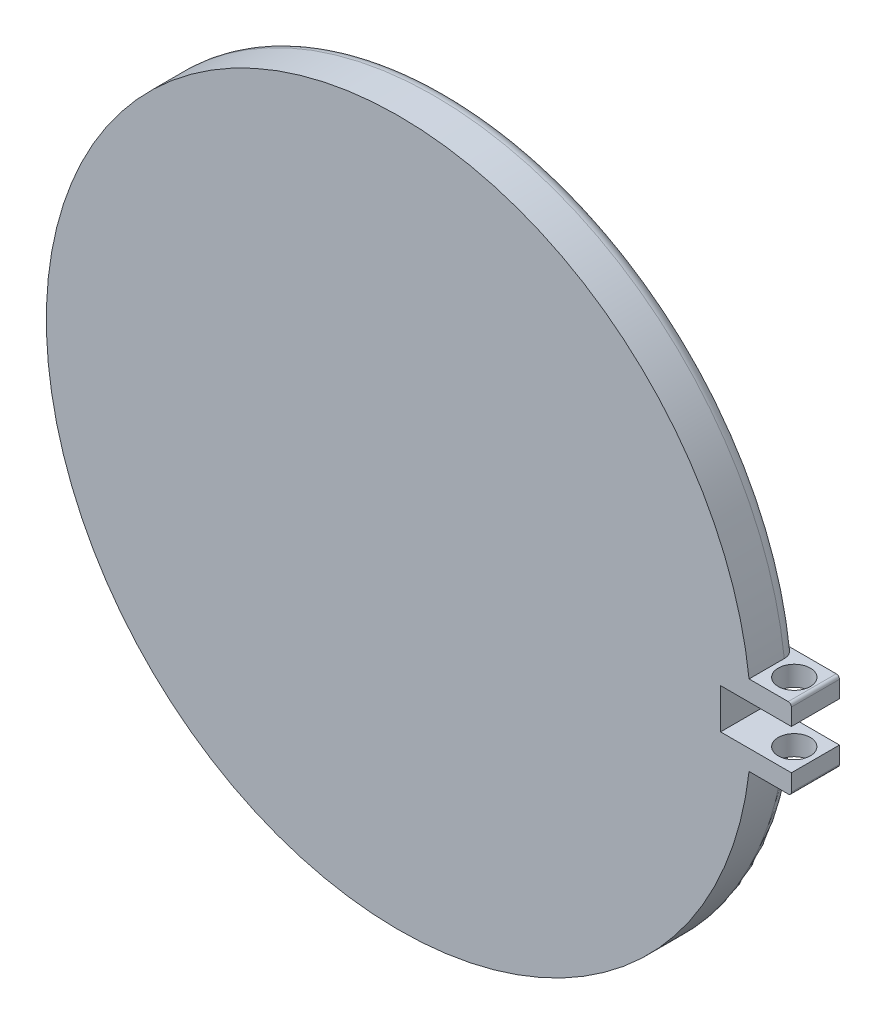
ISO-10303-21;
HEADER;
FILE_DESCRIPTION(('STEP AP214'),'2;1');
FILE_NAME('part.step','',(''),(''),'','','');
FILE_SCHEMA(('AUTOMOTIVE_DESIGN { 1 0 10303 214 1 1 1 1 }'));
ENDSEC;
DATA;
#1=APPLICATION_CONTEXT('core data for automotive mechanical design processes');
#2=APPLICATION_PROTOCOL_DEFINITION('international standard','automotive_design',2000,#1);
#3=PRODUCT_CONTEXT('',#1,'mechanical');
#4=PRODUCT('Part','Part','',(#3));
#5=PRODUCT_RELATED_PRODUCT_CATEGORY('part','',(#4));
#6=PRODUCT_DEFINITION_FORMATION('','',#4);
#7=PRODUCT_DEFINITION_CONTEXT('part definition',#1,'design');
#8=PRODUCT_DEFINITION('design','',#6,#7);
#9=PRODUCT_DEFINITION_SHAPE('','',#8);
#10=(LENGTH_UNIT() NAMED_UNIT(*) SI_UNIT(.MILLI.,.METRE.));
#11=(NAMED_UNIT(*) PLANE_ANGLE_UNIT() SI_UNIT($,.RADIAN.));
#12=(NAMED_UNIT(*) SI_UNIT($,.STERADIAN.) SOLID_ANGLE_UNIT());
#13=UNCERTAINTY_MEASURE_WITH_UNIT(LENGTH_MEASURE(1.E-05),#10,'distance_accuracy_value','');
#14=(GEOMETRIC_REPRESENTATION_CONTEXT(3) GLOBAL_UNCERTAINTY_ASSIGNED_CONTEXT((#13)) GLOBAL_UNIT_ASSIGNED_CONTEXT((#10,
#11,#12)) REPRESENTATION_CONTEXT('',''));
#15=CARTESIAN_POINT('',(0.,0.,0.));
#16=DIRECTION('',(0.,0.,1.));
#17=DIRECTION('',(1.,0.,0.));
#18=AXIS2_PLACEMENT_3D('',#15,#16,#17);
#19=CARTESIAN_POINT('',(24.5,2.5,0.));
#20=DIRECTION('',(1.,0.,0.));
#21=DIRECTION('',(0.,0.,-1.));
#22=AXIS2_PLACEMENT_3D('',#19,#20,#21);
#23=PLANE('',#22);
#24=DIRECTION('',(0.,1.,0.));
#25=VECTOR('',#24,1.);
#26=CARTESIAN_POINT('',(24.5,2.5,0.));
#27=LINE('',#26,#25);
#28=CARTESIAN_POINT('',(24.5,1.25,0.));
#29=VERTEX_POINT('',#28);
#30=CARTESIAN_POINT('',(24.5,2.3,0.));
#31=VERTEX_POINT('',#30);
#32=EDGE_CURVE('E168',#29,#31,#27,.T.);
#33=ORIENTED_EDGE('',*,*,#32,.T.);
#34=DIRECTION('',(0.,0.,1.));
#35=VECTOR('',#34,1.);
#36=CARTESIAN_POINT('',(24.5,2.3,0.));
#37=LINE('',#36,#35);
#38=CARTESIAN_POINT('',(24.5,2.3,3.));
#39=VERTEX_POINT('',#38);
#40=EDGE_CURVE('E205',#31,#39,#37,.T.);
#41=ORIENTED_EDGE('',*,*,#40,.T.);
#42=DIRECTION('',(0.,1.,0.));
#43=VECTOR('',#42,1.);
#44=CARTESIAN_POINT('',(24.5,2.5,3.));
#45=LINE('',#44,#43);
#46=CARTESIAN_POINT('',(24.5,1.25,3.));
#47=VERTEX_POINT('',#46);
#48=EDGE_CURVE('E164',#47,#39,#45,.T.);
#49=ORIENTED_EDGE('',*,*,#48,.F.);
#50=DIRECTION('',(0.,0.,1.));
#51=VECTOR('',#50,1.);
#52=CARTESIAN_POINT('',(24.5,1.25,0.));
#53=LINE('',#52,#51);
#54=EDGE_CURVE('E132',#29,#47,#53,.T.);
#55=ORIENTED_EDGE('',*,*,#54,.F.);
#56=EDGE_LOOP('',(#33,#41,#49,#55));
#57=FACE_BOUND('',#56,.T.);
#58=ADVANCED_FACE('F33',(#57),#23,.T.);
#59=CARTESIAN_POINT('',(23.1787464971972,-22.,1.5));
#60=DIRECTION('',(0.,1.,0.));
#61=DIRECTION('',(0.,0.,1.));
#62=AXIS2_PLACEMENT_3D('',#59,#60,#61);
#63=CYLINDRICAL_SURFACE('',#62,1.);
#64=CARTESIAN_POINT('',(23.1787464971972,1.25,1.5));
#65=DIRECTION('',(0.,1.,0.));
#66=DIRECTION('',(0.,0.,1.));
#67=AXIS2_PLACEMENT_3D('',#64,#65,#66);
#68=CIRCLE('',#67,1.);
#69=CARTESIAN_POINT('',(23.1787464971972,1.25,2.5));
#70=VERTEX_POINT('',#69);
#71=EDGE_CURVE('E188',#70,#70,#68,.F.);
#72=ORIENTED_EDGE('',*,*,#71,.T.);
#73=EDGE_LOOP('',(#72));
#74=FACE_BOUND('',#73,.T.);
#75=CARTESIAN_POINT('',(23.1787464971972,2.5,1.5));
#76=DIRECTION('',(0.,1.,0.));
#77=DIRECTION('',(0.,0.,1.));
#78=AXIS2_PLACEMENT_3D('',#75,#76,#77);
#79=CIRCLE('',#78,1.);
#80=CARTESIAN_POINT('',(23.1787464971972,2.5,2.5));
#81=VERTEX_POINT('',#80);
#82=EDGE_CURVE('E165',#81,#81,#79,.T.);
#83=ORIENTED_EDGE('',*,*,#82,.T.);
#84=EDGE_LOOP('',(#83));
#85=FACE_BOUND('',#84,.T.);
#86=ADVANCED_FACE('F242',(#74,#85),#63,.F.);
#87=CARTESIAN_POINT('',(0.,0.,3.));
#88=DIRECTION('',(0.,0.,-1.));
#89=DIRECTION('',(-1.,0.,0.));
#90=AXIS2_PLACEMENT_3D('',#87,#88,#89);
#91=CYLINDRICAL_SURFACE('',#90,22.);
#92=DIRECTION('',(0.,0.,-1.));
#93=VECTOR('',#92,1.);
#94=CARTESIAN_POINT('',(21.8574929943944,2.5,3.));
#95=LINE('',#94,#93);
#96=CARTESIAN_POINT('',(21.8574929943944,2.5,3.));
#97=VERTEX_POINT('',#96);
#98=CARTESIAN_POINT('',(21.8574929943944,2.5,0.8));
#99=VERTEX_POINT('',#98);
#100=EDGE_CURVE('E171',#97,#99,#95,.T.);
#101=ORIENTED_EDGE('',*,*,#100,.T.);
#102=CARTESIAN_POINT('',(0.,0.,0.8));
#103=DIRECTION('',(0.,0.,1.));
#104=DIRECTION('',(1.,0.,0.));
#105=AXIS2_PLACEMENT_3D('',#102,#103,#104);
#106=CIRCLE('',#105,22.);
#107=CARTESIAN_POINT('',(21.8574929943944,-2.5,0.8));
#108=VERTEX_POINT('',#107);
#109=EDGE_CURVE('E210',#99,#108,#106,.T.);
#110=ORIENTED_EDGE('',*,*,#109,.T.);
#111=DIRECTION('',(0.,0.,-1.));
#112=VECTOR('',#111,1.);
#113=CARTESIAN_POINT('',(21.8574929943944,-2.5,3.));
#114=LINE('',#113,#112);
#115=CARTESIAN_POINT('',(21.8574929943944,-2.5,3.));
#116=VERTEX_POINT('',#115);
#117=EDGE_CURVE('E180',#108,#116,#114,.F.);
#118=ORIENTED_EDGE('',*,*,#117,.T.);
#119=CARTESIAN_POINT('',(0.,0.,3.));
#120=DIRECTION('',(0.,0.,1.));
#121=DIRECTION('',(1.,0.,0.));
#122=AXIS2_PLACEMENT_3D('',#119,#120,#121);
#123=CIRCLE('',#122,22.);
#124=EDGE_CURVE('E182',#97,#116,#123,.T.);
#125=ORIENTED_EDGE('',*,*,#124,.F.);
#126=EDGE_LOOP('',(#101,#110,#118,#125));
#127=FACE_BOUND('',#126,.T.);
#128=ADVANCED_FACE('F237',(#127),#91,.T.);
#129=CARTESIAN_POINT('',(0.,0.,3.));
#130=DIRECTION('',(0.,0.,1.));
#131=DIRECTION('',(1.,0.,0.));
#132=AXIS2_PLACEMENT_3D('',#129,#130,#131);
#133=PLANE('',#132);
#134=DIRECTION('',(0.,-1.,0.));
#135=VECTOR('',#134,1.);
#136=CARTESIAN_POINT('',(20.08,1.25,3.));
#137=LINE('',#136,#135);
#138=CARTESIAN_POINT('',(20.08,1.25,3.));
#139=VERTEX_POINT('',#138);
#140=CARTESIAN_POINT('',(20.08,-1.25,3.));
#141=VERTEX_POINT('',#140);
#142=EDGE_CURVE('E125',#139,#141,#137,.T.);
#143=ORIENTED_EDGE('',*,*,#142,.F.);
#144=DIRECTION('',(1.,0.,0.));
#145=VECTOR('',#144,1.);
#146=CARTESIAN_POINT('',(21.9,1.25,3.));
#147=LINE('',#146,#145);
#148=EDGE_CURVE('E155',#139,#47,#147,.T.);
#149=ORIENTED_EDGE('',*,*,#148,.T.);
#150=ORIENTED_EDGE('',*,*,#48,.T.);
#151=CARTESIAN_POINT('',(24.3,2.3,3.));
#152=DIRECTION('',(0.,0.,1.));
#153=DIRECTION('',(1.,0.,0.));
#154=AXIS2_PLACEMENT_3D('',#151,#152,#153);
#155=CIRCLE('',#154,0.2);
#156=CARTESIAN_POINT('',(24.3,2.5,3.));
#157=VERTEX_POINT('',#156);
#158=EDGE_CURVE('E195',#39,#157,#155,.T.);
#159=ORIENTED_EDGE('',*,*,#158,.T.);
#160=DIRECTION('',(-1.,0.,0.));
#161=VECTOR('',#160,1.);
#162=CARTESIAN_POINT('',(19.5,2.5,3.));
#163=LINE('',#162,#161);
#164=EDGE_CURVE('E173',#157,#97,#163,.T.);
#165=ORIENTED_EDGE('',*,*,#164,.T.);
#166=ORIENTED_EDGE('',*,*,#124,.T.);
#167=DIRECTION('',(1.,0.,0.));
#168=VECTOR('',#167,1.);
#169=CARTESIAN_POINT('',(19.5,-2.5,3.));
#170=LINE('',#169,#168);
#171=CARTESIAN_POINT('',(24.3,-2.5,3.));
#172=VERTEX_POINT('',#171);
#173=EDGE_CURVE('E175',#116,#172,#170,.T.);
#174=ORIENTED_EDGE('',*,*,#173,.T.);
#175=CARTESIAN_POINT('',(24.3,-2.3,3.));
#176=DIRECTION('',(0.,0.,1.));
#177=DIRECTION('',(1.,0.,0.));
#178=AXIS2_PLACEMENT_3D('',#175,#176,#177);
#179=CIRCLE('',#178,0.2);
#180=CARTESIAN_POINT('',(24.5,-2.3,3.));
#181=VERTEX_POINT('',#180);
#182=EDGE_CURVE('E197',#172,#181,#179,.T.);
#183=ORIENTED_EDGE('',*,*,#182,.T.);
#184=CARTESIAN_POINT('',(24.5,-1.25,3.));
#185=VERTEX_POINT('',#184);
#186=EDGE_CURVE('E127',#181,#185,#45,.T.);
#187=ORIENTED_EDGE('',*,*,#186,.T.);
#188=DIRECTION('',(1.,0.,0.));
#189=VECTOR('',#188,1.);
#190=CARTESIAN_POINT('',(21.9,-1.25,3.));
#191=LINE('',#190,#189);
#192=EDGE_CURVE('E120',#141,#185,#191,.T.);
#193=ORIENTED_EDGE('',*,*,#192,.F.);
#194=EDGE_LOOP('',(#143,#149,#150,#159,#165,#166,#174,#183,#187,#193));
#195=FACE_BOUND('',#194,.T.);
#196=ADVANCED_FACE('F122',(#195),#133,.T.);
#197=CARTESIAN_POINT('',(0.,0.,0.));
#198=DIRECTION('',(0.,0.,1.));
#199=DIRECTION('',(1.,0.,0.));
#200=AXIS2_PLACEMENT_3D('',#197,#198,#199);
#201=PLANE('',#200);
#202=DIRECTION('',(1.,0.,0.));
#203=VECTOR('',#202,1.);
#204=CARTESIAN_POINT('',(21.9,1.25,0.));
#205=LINE('',#204,#203);
#206=CARTESIAN_POINT('',(20.08,1.25,0.));
#207=VERTEX_POINT('',#206);
#208=EDGE_CURVE('E158',#207,#29,#205,.T.);
#209=ORIENTED_EDGE('',*,*,#208,.F.);
#210=DIRECTION('',(0.,1.,0.));
#211=VECTOR('',#210,1.);
#212=CARTESIAN_POINT('',(20.08,1.25,0.));
#213=LINE('',#212,#211);
#214=CARTESIAN_POINT('',(20.08,-1.25,0.));
#215=VERTEX_POINT('',#214);
#216=EDGE_CURVE('E142',#215,#207,#213,.T.);
#217=ORIENTED_EDGE('',*,*,#216,.F.);
#218=DIRECTION('',(1.,0.,0.));
#219=VECTOR('',#218,1.);
#220=CARTESIAN_POINT('',(21.9,-1.25,0.));
#221=LINE('',#220,#219);
#222=CARTESIAN_POINT('',(24.5,-1.25,0.));
#223=VERTEX_POINT('',#222);
#224=EDGE_CURVE('E131',#215,#223,#221,.T.);
#225=ORIENTED_EDGE('',*,*,#224,.T.);
#226=CARTESIAN_POINT('',(24.5,-2.3,0.));
#227=VERTEX_POINT('',#226);
#228=EDGE_CURVE('E166',#227,#223,#27,.T.);
#229=ORIENTED_EDGE('',*,*,#228,.F.);
#230=CARTESIAN_POINT('',(24.3,-2.3,0.));
#231=DIRECTION('',(0.,0.,1.));
#232=DIRECTION('',(1.,0.,0.));
#233=AXIS2_PLACEMENT_3D('',#230,#231,#232);
#234=CIRCLE('',#233,0.2);
#235=CARTESIAN_POINT('',(24.3,-2.5,0.));
#236=VERTEX_POINT('',#235);
#237=EDGE_CURVE('E203',#227,#236,#234,.F.);
#238=ORIENTED_EDGE('',*,*,#237,.T.);
#239=DIRECTION('',(1.,0.,0.));
#240=VECTOR('',#239,1.);
#241=CARTESIAN_POINT('',(19.5,-2.5,0.));
#242=LINE('',#241,#240);
#243=CARTESIAN_POINT('',(21.0520782822029,-2.5,0.));
#244=VERTEX_POINT('',#243);
#245=EDGE_CURVE('E53',#244,#236,#242,.T.);
#246=ORIENTED_EDGE('',*,*,#245,.F.);
#247=CARTESIAN_POINT('',(0.,0.,0.));
#248=DIRECTION('',(0.,0.,1.));
#249=DIRECTION('',(1.,0.,0.));
#250=AXIS2_PLACEMENT_3D('',#247,#248,#249);
#251=CIRCLE('',#250,21.2);
#252=CARTESIAN_POINT('',(21.0520782822029,2.5,0.));
#253=VERTEX_POINT('',#252);
#254=EDGE_CURVE('E213',#244,#253,#251,.F.);
#255=ORIENTED_EDGE('',*,*,#254,.T.);
#256=DIRECTION('',(-1.,0.,0.));
#257=VECTOR('',#256,1.);
#258=CARTESIAN_POINT('',(19.5,2.5,0.));
#259=LINE('',#258,#257);
#260=CARTESIAN_POINT('',(24.3,2.5,0.));
#261=VERTEX_POINT('',#260);
#262=EDGE_CURVE('E60',#261,#253,#259,.T.);
#263=ORIENTED_EDGE('',*,*,#262,.F.);
#264=CARTESIAN_POINT('',(24.3,2.3,0.));
#265=DIRECTION('',(0.,0.,1.));
#266=DIRECTION('',(1.,0.,0.));
#267=AXIS2_PLACEMENT_3D('',#264,#265,#266);
#268=CIRCLE('',#267,0.2);
#269=EDGE_CURVE('E201',#261,#31,#268,.F.);
#270=ORIENTED_EDGE('',*,*,#269,.T.);
#271=ORIENTED_EDGE('',*,*,#32,.F.);
#272=EDGE_LOOP('',(#209,#217,#225,#229,#238,#246,#255,#263,#270,#271));
#273=FACE_BOUND('',#272,.T.);
#274=ADVANCED_FACE('F223',(#273),#201,.F.);
#275=CARTESIAN_POINT('',(19.5,-2.5,0.));
#276=DIRECTION('',(0.,-1.,0.));
#277=DIRECTION('',(0.,0.,-1.));
#278=AXIS2_PLACEMENT_3D('',#275,#276,#277);
#279=PLANE('',#278);
#280=CARTESIAN_POINT('',(23.1787464971972,-2.5,1.5));
#281=DIRECTION('',(0.,-1.,0.));
#282=DIRECTION('',(0.,0.,-1.));
#283=AXIS2_PLACEMENT_3D('',#280,#281,#282);
#284=CIRCLE('',#283,1.);
#285=CARTESIAN_POINT('',(23.1787464971972,-2.5,0.499999999999999));
#286=VERTEX_POINT('',#285);
#287=EDGE_CURVE('E161',#286,#286,#284,.T.);
#288=ORIENTED_EDGE('',*,*,#287,.F.);
#289=EDGE_LOOP('',(#288));
#290=FACE_BOUND('',#289,.T.);
#291=ORIENTED_EDGE('',*,*,#245,.T.);
#292=DIRECTION('',(0.,0.,1.));
#293=VECTOR('',#292,1.);
#294=CARTESIAN_POINT('',(24.3,-2.5,0.));
#295=LINE('',#294,#293);
#296=EDGE_CURVE('E185',#236,#172,#295,.T.);
#297=ORIENTED_EDGE('',*,*,#296,.T.);
#298=ORIENTED_EDGE('',*,*,#173,.F.);
#299=ORIENTED_EDGE('',*,*,#117,.F.);
#300=CARTESIAN_POINT('',(21.8574929943944,-2.5,0.8));
#301=CARTESIAN_POINT('',(21.8575323983029,-2.5,0.755206794752053));
#302=CARTESIAN_POINT('',(21.8537088169753,-2.5,0.710426684375354));
#303=CARTESIAN_POINT('',(21.838628437868,-2.5,0.622178597568789));
#304=CARTESIAN_POINT('',(21.827378818546,-2.5,0.578709396326376));
#305=CARTESIAN_POINT('',(21.7977318750486,-2.5,0.494260113469563));
#306=CARTESIAN_POINT('',(21.7793315577597,-2.5,0.453281082498632));
#307=CARTESIAN_POINT('',(21.7359360852393,-2.5,0.374987058209343));
#308=CARTESIAN_POINT('',(21.7109417600343,-2.5,0.337671604545614));
#309=CARTESIAN_POINT('',(21.6549983169677,-2.5,0.267639070847792));
#310=CARTESIAN_POINT('',(21.6240328290373,-2.5,0.234935070045012));
#311=CARTESIAN_POINT('',(21.5570743364598,-2.5,0.175145063514615));
#312=CARTESIAN_POINT('',(21.5210803001772,-2.5,0.148060213428612));
#313=CARTESIAN_POINT('',(21.4448524496375,-2.5,0.100102106746732));
#314=CARTESIAN_POINT('',(21.4045931982682,-2.5,0.0792693267939344));
#315=CARTESIAN_POINT('',(21.3211700769108,-2.5,0.0446204893486213));
#316=CARTESIAN_POINT('',(21.2780076302695,-2.5,0.0308010214374727));
#317=CARTESIAN_POINT('',(21.2041901894434,-2.5,0.0138014558993165));
#318=CARTESIAN_POINT('',(21.1739785174373,-2.5,0.00862885620354199));
#319=CARTESIAN_POINT('',(21.1132079390581,-2.5,0.00172844026307003));
#320=CARTESIAN_POINT('',(21.082649588046,-2.5,-4.2679891576566E-06));
#321=CARTESIAN_POINT('',(21.0520782822029,-2.5,0.));
#322=B_SPLINE_CURVE_WITH_KNOTS('',3,(#300,#301,#302,#303,#304,#305,#306,#307,#308,#309,#310,
#311,#312,#313,#314,#315,#316,#317,#318,#319,#320,#321),.UNSPECIFIED.,.F.,.F.,(4,2,2,2,2,2,2,2,
2,2,4),(0.,0.134197634220758,0.268265734479397,0.40239001303304,0.536497416625006,
0.67097784428565,0.805485902003287,0.940846873129491,1.07614195798415,1.16791217423907,
1.25955178663206),.UNSPECIFIED.);
#323=EDGE_CURVE('E46',#108,#244,#322,.T.);
#324=ORIENTED_EDGE('',*,*,#323,.T.);
#325=EDGE_LOOP('',(#291,#297,#298,#299,#324));
#326=FACE_BOUND('',#325,.T.);
#327=ADVANCED_FACE('F218',(#290,#326),#279,.T.);
#328=CARTESIAN_POINT('',(19.5,2.5,0.));
#329=DIRECTION('',(0.,1.,0.));
#330=DIRECTION('',(0.,0.,1.));
#331=AXIS2_PLACEMENT_3D('',#328,#329,#330);
#332=PLANE('',#331);
#333=ORIENTED_EDGE('',*,*,#82,.F.);
#334=EDGE_LOOP('',(#333));
#335=FACE_BOUND('',#334,.T.);
#336=ORIENTED_EDGE('',*,*,#164,.F.);
#337=DIRECTION('',(0.,0.,1.));
#338=VECTOR('',#337,1.);
#339=CARTESIAN_POINT('',(24.3,2.5,0.));
#340=LINE('',#339,#338);
#341=EDGE_CURVE('E208',#157,#261,#340,.F.);
#342=ORIENTED_EDGE('',*,*,#341,.T.);
#343=ORIENTED_EDGE('',*,*,#262,.T.);
#344=CARTESIAN_POINT('',(21.0520782822029,2.5,0.));
#345=CARTESIAN_POINT('',(21.0976178807076,2.5,-3.72489311876958E-05));
#346=CARTESIAN_POINT('',(21.1431481988742,2.5,0.00383223828765159));
#347=CARTESIAN_POINT('',(21.2328992513541,2.5,0.0191145377678495));
#348=CARTESIAN_POINT('',(21.2771207220915,2.5,0.0305230205424953));
#349=CARTESIAN_POINT('',(21.3630422465806,2.5,0.0606221506546867));
#350=CARTESIAN_POINT('',(21.4047408758473,2.5,0.07931686853522));
#351=CARTESIAN_POINT('',(21.4843845526506,2.5,0.123458076702455));
#352=CARTESIAN_POINT('',(21.5223304890414,2.5,0.148902962876772));
#353=CARTESIAN_POINT('',(21.5932581160992,2.5,0.205744879161273));
#354=CARTESIAN_POINT('',(21.6262559960535,2.5,0.237121703645859));
#355=CARTESIAN_POINT('',(21.6864811583727,2.5,0.305009635928708));
#356=CARTESIAN_POINT('',(21.7137073817718,2.5,0.341521683881209));
#357=CARTESIAN_POINT('',(21.7614250015,2.5,0.418389109107933));
#358=CARTESIAN_POINT('',(21.7819572731295,2.5,0.458719142736872));
#359=CARTESIAN_POINT('',(21.8159027752129,2.5,0.542258430715124));
#360=CARTESIAN_POINT('',(21.8293208433886,2.5,0.585465705952222));
#361=CARTESIAN_POINT('',(21.8451369064943,2.5,0.657471179605751));
#362=CARTESIAN_POINT('',(21.8497677000959,2.5,0.685798519011981));
#363=CARTESIAN_POINT('',(21.855945171347,2.5,0.742746418508006));
#364=CARTESIAN_POINT('',(21.8574962492435,2.5,0.771366501435026));
#365=CARTESIAN_POINT('',(21.8574929943944,2.5,0.8));
#366=B_SPLINE_CURVE_WITH_KNOTS('',3,(#344,#345,#346,#347,#348,#349,#350,#351,#352,#353,#354,
#355,#356,#357,#358,#359,#360,#361,#362,#363,#364,#365),.UNSPECIFIED.,.F.,.F.,(4,2,2,2,2,2,2,2,
2,2,4),(0.,0.136441760442699,0.272805233264416,0.409244996632523,0.545652365406625,
0.681603206437472,0.817578969760933,0.952708155649584,1.08774533424824,1.17370059735632,
1.25953296037332),.UNSPECIFIED.);
#367=EDGE_CURVE('E11',#253,#99,#366,.T.);
#368=ORIENTED_EDGE('',*,*,#367,.T.);
#369=ORIENTED_EDGE('',*,*,#100,.F.);
#370=EDGE_LOOP('',(#336,#342,#343,#368,#369));
#371=FACE_BOUND('',#370,.T.);
#372=ADVANCED_FACE('F222',(#335,#371),#332,.T.);
#373=ORIENTED_EDGE('',*,*,#186,.F.);
#374=DIRECTION('',(0.,0.,1.));
#375=VECTOR('',#374,1.);
#376=CARTESIAN_POINT('',(24.5,-2.3,0.));
#377=LINE('',#376,#375);
#378=EDGE_CURVE('E199',#181,#227,#377,.F.);
#379=ORIENTED_EDGE('',*,*,#378,.T.);
#380=ORIENTED_EDGE('',*,*,#228,.T.);
#381=DIRECTION('',(0.,0.,-1.));
#382=VECTOR('',#381,1.);
#383=CARTESIAN_POINT('',(24.5,-1.25,0.));
#384=LINE('',#383,#382);
#385=EDGE_CURVE('E152',#185,#223,#384,.T.);
#386=ORIENTED_EDGE('',*,*,#385,.F.);
#387=EDGE_LOOP('',(#373,#379,#380,#386));
#388=FACE_BOUND('',#387,.T.);
#389=ADVANCED_FACE('F230',(#388),#23,.T.);
#390=CARTESIAN_POINT('',(23.1787464971972,-1.25,1.5));
#391=DIRECTION('',(0.,-1.,0.));
#392=DIRECTION('',(0.,0.,-1.));
#393=AXIS2_PLACEMENT_3D('',#390,#391,#392);
#394=CIRCLE('',#393,1.);
#395=CARTESIAN_POINT('',(23.1787464971972,-1.25,0.499999999999999));
#396=VERTEX_POINT('',#395);
#397=EDGE_CURVE('E157',#396,#396,#394,.F.);
#398=ORIENTED_EDGE('',*,*,#397,.T.);
#399=EDGE_LOOP('',(#398));
#400=FACE_BOUND('',#399,.T.);
#401=ORIENTED_EDGE('',*,*,#287,.T.);
#402=EDGE_LOOP('',(#401));
#403=FACE_BOUND('',#402,.T.);
#404=ADVANCED_FACE('F225',(#400,#403),#63,.F.);
#405=CARTESIAN_POINT('',(21.9,1.25,0.));
#406=DIRECTION('',(0.,1.,0.));
#407=DIRECTION('',(0.,0.,1.));
#408=AXIS2_PLACEMENT_3D('',#405,#406,#407);
#409=PLANE('',#408);
#410=ORIENTED_EDGE('',*,*,#54,.T.);
#411=ORIENTED_EDGE('',*,*,#148,.F.);
#412=DIRECTION('',(0.,0.,1.));
#413=VECTOR('',#412,1.);
#414=CARTESIAN_POINT('',(20.08,1.25,3.));
#415=LINE('',#414,#413);
#416=EDGE_CURVE('E147',#207,#139,#415,.T.);
#417=ORIENTED_EDGE('',*,*,#416,.F.);
#418=ORIENTED_EDGE('',*,*,#208,.T.);
#419=EDGE_LOOP('',(#410,#411,#417,#418));
#420=FACE_BOUND('',#419,.T.);
#421=ORIENTED_EDGE('',*,*,#71,.F.);
#422=EDGE_LOOP('',(#421));
#423=FACE_BOUND('',#422,.T.);
#424=ADVANCED_FACE('F281',(#420,#423),#409,.F.);
#425=CARTESIAN_POINT('',(21.9,-1.25,0.));
#426=DIRECTION('',(0.,-1.,0.));
#427=DIRECTION('',(0.,0.,-1.));
#428=AXIS2_PLACEMENT_3D('',#425,#426,#427);
#429=PLANE('',#428);
#430=ORIENTED_EDGE('',*,*,#385,.T.);
#431=ORIENTED_EDGE('',*,*,#224,.F.);
#432=DIRECTION('',(0.,0.,-1.));
#433=VECTOR('',#432,1.);
#434=CARTESIAN_POINT('',(20.08,-1.25,3.));
#435=LINE('',#434,#433);
#436=EDGE_CURVE('E135',#141,#215,#435,.T.);
#437=ORIENTED_EDGE('',*,*,#436,.F.);
#438=ORIENTED_EDGE('',*,*,#192,.T.);
#439=EDGE_LOOP('',(#430,#431,#437,#438));
#440=FACE_BOUND('',#439,.T.);
#441=ORIENTED_EDGE('',*,*,#397,.F.);
#442=EDGE_LOOP('',(#441));
#443=FACE_BOUND('',#442,.T.);
#444=ADVANCED_FACE('F136',(#440,#443),#429,.F.);
#445=CARTESIAN_POINT('',(24.3,-2.3,0.));
#446=DIRECTION('',(0.,0.,1.));
#447=DIRECTION('',(1.,0.,0.));
#448=AXIS2_PLACEMENT_3D('',#445,#446,#447);
#449=CYLINDRICAL_SURFACE('',#448,0.2);
#450=ORIENTED_EDGE('',*,*,#237,.F.);
#451=ORIENTED_EDGE('',*,*,#378,.F.);
#452=ORIENTED_EDGE('',*,*,#182,.F.);
#453=ORIENTED_EDGE('',*,*,#296,.F.);
#454=EDGE_LOOP('',(#450,#451,#452,#453));
#455=FACE_BOUND('',#454,.T.);
#456=ADVANCED_FACE('F244',(#455),#449,.T.);
#457=CARTESIAN_POINT('',(24.3,2.3,0.));
#458=DIRECTION('',(0.,0.,1.));
#459=DIRECTION('',(1.,0.,0.));
#460=AXIS2_PLACEMENT_3D('',#457,#458,#459);
#461=CYLINDRICAL_SURFACE('',#460,0.2);
#462=ORIENTED_EDGE('',*,*,#269,.F.);
#463=ORIENTED_EDGE('',*,*,#341,.F.);
#464=ORIENTED_EDGE('',*,*,#158,.F.);
#465=ORIENTED_EDGE('',*,*,#40,.F.);
#466=EDGE_LOOP('',(#462,#463,#464,#465));
#467=FACE_BOUND('',#466,.T.);
#468=ADVANCED_FACE('F246',(#467),#461,.T.);
#469=CARTESIAN_POINT('',(0.,0.,0.8));
#470=DIRECTION('',(0.,0.,1.));
#471=DIRECTION('',(1.,0.,0.));
#472=AXIS2_PLACEMENT_3D('',#469,#470,#471);
#473=TOROIDAL_SURFACE('',#472,21.2,0.8);
#474=ORIENTED_EDGE('',*,*,#367,.F.);
#475=ORIENTED_EDGE('',*,*,#254,.F.);
#476=ORIENTED_EDGE('',*,*,#323,.F.);
#477=ORIENTED_EDGE('',*,*,#109,.F.);
#478=EDGE_LOOP('',(#474,#475,#476,#477));
#479=FACE_BOUND('',#478,.T.);
#480=ADVANCED_FACE('F35',(#479),#473,.T.);
#481=CARTESIAN_POINT('',(20.08,0.,0.));
#482=DIRECTION('',(1.,0.,0.));
#483=DIRECTION('',(0.,0.,-1.));
#484=AXIS2_PLACEMENT_3D('',#481,#482,#483);
#485=PLANE('',#484);
#486=ORIENTED_EDGE('',*,*,#142,.T.);
#487=ORIENTED_EDGE('',*,*,#436,.T.);
#488=ORIENTED_EDGE('',*,*,#216,.T.);
#489=ORIENTED_EDGE('',*,*,#416,.T.);
#490=EDGE_LOOP('',(#486,#487,#488,#489));
#491=FACE_BOUND('',#490,.T.);
#492=ADVANCED_FACE('F145',(#491),#485,.T.);
#493=CLOSED_SHELL('',(#58,#86,#128,#196,#274,#327,#372,#389,#404,#424,#444,#456,#468,#480,#492));
#494=MANIFOLD_SOLID_BREP('B2',#493);
#495=ADVANCED_BREP_SHAPE_REPRESENTATION('',(#18,#494),#14);
#496=SHAPE_DEFINITION_REPRESENTATION(#9,#495);
ENDSEC;
END-ISO-10303-21;
